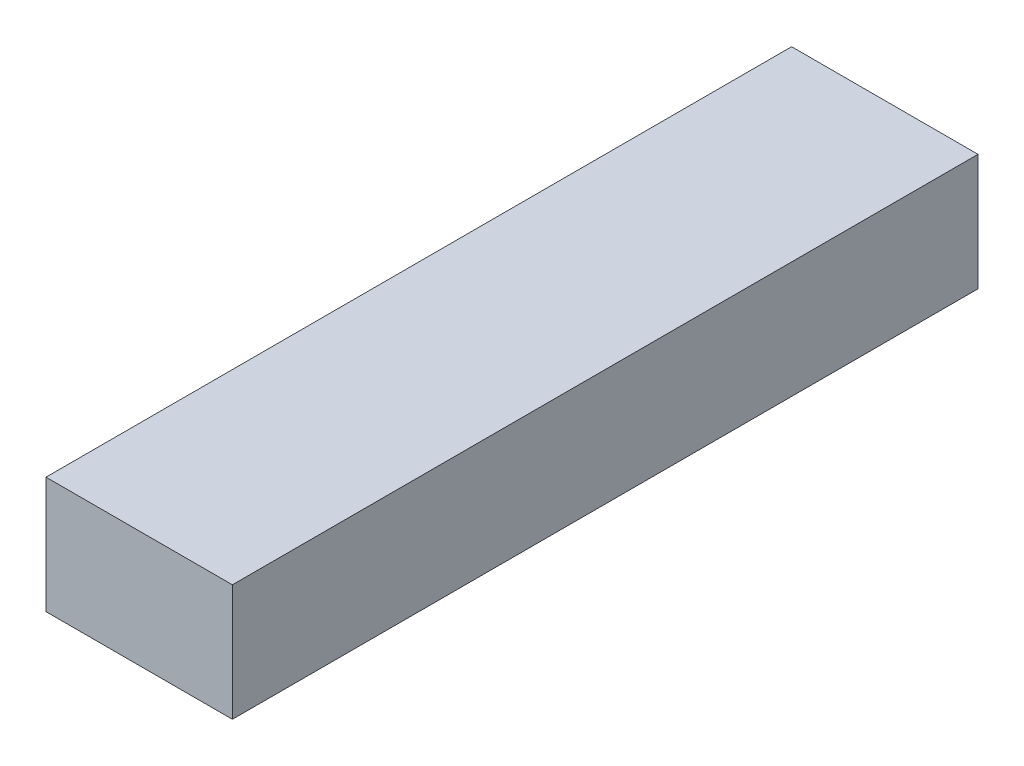
ISO-10303-21;
HEADER;
FILE_DESCRIPTION(('STEP AP214'),'2;1');
FILE_NAME('part.step','',(''),(''),'','','');
FILE_SCHEMA(('AUTOMOTIVE_DESIGN { 1 0 10303 214 1 1 1 1 }'));
ENDSEC;
DATA;
#1=APPLICATION_CONTEXT('core data for automotive mechanical design processes');
#2=APPLICATION_PROTOCOL_DEFINITION('international standard','automotive_design',2000,#1);
#3=PRODUCT_CONTEXT('',#1,'mechanical');
#4=PRODUCT('Part','Part','',(#3));
#5=PRODUCT_RELATED_PRODUCT_CATEGORY('part','',(#4));
#6=PRODUCT_DEFINITION_FORMATION('','',#4);
#7=PRODUCT_DEFINITION_CONTEXT('part definition',#1,'design');
#8=PRODUCT_DEFINITION('design','',#6,#7);
#9=PRODUCT_DEFINITION_SHAPE('','',#8);
#10=(LENGTH_UNIT() NAMED_UNIT(*) SI_UNIT(.MILLI.,.METRE.));
#11=(NAMED_UNIT(*) PLANE_ANGLE_UNIT() SI_UNIT($,.RADIAN.));
#12=(NAMED_UNIT(*) SI_UNIT($,.STERADIAN.) SOLID_ANGLE_UNIT());
#13=UNCERTAINTY_MEASURE_WITH_UNIT(LENGTH_MEASURE(1.E-05),#10,'distance_accuracy_value','');
#14=(GEOMETRIC_REPRESENTATION_CONTEXT(3) GLOBAL_UNCERTAINTY_ASSIGNED_CONTEXT((#13)) GLOBAL_UNIT_ASSIGNED_CONTEXT((#10,
#11,#12)) REPRESENTATION_CONTEXT('',''));
#15=CARTESIAN_POINT('',(0.,0.,0.));
#16=DIRECTION('',(0.,0.,1.));
#17=DIRECTION('',(1.,0.,0.));
#18=AXIS2_PLACEMENT_3D('',#15,#16,#17);
#19=CARTESIAN_POINT('',(-5.08,6.35,-20.32));
#20=DIRECTION('',(1.,0.,0.));
#21=DIRECTION('',(0.,0.,-1.));
#22=AXIS2_PLACEMENT_3D('',#19,#20,#21);
#23=PLANE('',#22);
#24=DIRECTION('',(0.,0.,1.));
#25=VECTOR('',#24,1.);
#26=CARTESIAN_POINT('',(-5.08,0.,-20.32));
#27=LINE('',#26,#25);
#28=CARTESIAN_POINT('',(-5.08,0.,-20.32));
#29=VERTEX_POINT('',#28);
#30=CARTESIAN_POINT('',(-5.08,0.,20.32));
#31=VERTEX_POINT('',#30);
#32=EDGE_CURVE('E113',#29,#31,#27,.T.);
#33=ORIENTED_EDGE('',*,*,#32,.T.);
#34=DIRECTION('',(0.,-1.,0.));
#35=VECTOR('',#34,1.);
#36=CARTESIAN_POINT('',(-5.08,6.35,20.32));
#37=LINE('',#36,#35);
#38=CARTESIAN_POINT('',(-5.08,6.35,20.32));
#39=VERTEX_POINT('',#38);
#40=EDGE_CURVE('E11',#39,#31,#37,.T.);
#41=ORIENTED_EDGE('',*,*,#40,.F.);
#42=DIRECTION('',(0.,0.,1.));
#43=VECTOR('',#42,1.);
#44=CARTESIAN_POINT('',(-5.08,6.35,-20.32));
#45=LINE('',#44,#43);
#46=CARTESIAN_POINT('',(-5.08,6.35,-20.32));
#47=VERTEX_POINT('',#46);
#48=EDGE_CURVE('E97',#47,#39,#45,.T.);
#49=ORIENTED_EDGE('',*,*,#48,.F.);
#50=DIRECTION('',(0.,-1.,0.));
#51=VECTOR('',#50,1.);
#52=CARTESIAN_POINT('',(-5.08,6.35,-20.32));
#53=LINE('',#52,#51);
#54=EDGE_CURVE('E109',#47,#29,#53,.T.);
#55=ORIENTED_EDGE('',*,*,#54,.T.);
#56=EDGE_LOOP('',(#33,#41,#49,#55));
#57=FACE_BOUND('',#56,.T.);
#58=ADVANCED_FACE('F45',(#57),#23,.F.);
#59=CARTESIAN_POINT('',(-5.08,6.35,20.32));
#60=DIRECTION('',(0.,0.,-1.));
#61=DIRECTION('',(-1.,0.,0.));
#62=AXIS2_PLACEMENT_3D('',#59,#60,#61);
#63=PLANE('',#62);
#64=DIRECTION('',(1.,0.,0.));
#65=VECTOR('',#64,1.);
#66=CARTESIAN_POINT('',(-5.08,0.,20.32));
#67=LINE('',#66,#65);
#68=CARTESIAN_POINT('',(5.08,0.,20.32));
#69=VERTEX_POINT('',#68);
#70=EDGE_CURVE('E102',#31,#69,#67,.T.);
#71=ORIENTED_EDGE('',*,*,#70,.T.);
#72=DIRECTION('',(0.,-1.,0.));
#73=VECTOR('',#72,1.);
#74=CARTESIAN_POINT('',(5.08,6.35,20.32));
#75=LINE('',#74,#73);
#76=CARTESIAN_POINT('',(5.08,6.35,20.32));
#77=VERTEX_POINT('',#76);
#78=EDGE_CURVE('E54',#77,#69,#75,.T.);
#79=ORIENTED_EDGE('',*,*,#78,.F.);
#80=DIRECTION('',(1.,0.,0.));
#81=VECTOR('',#80,1.);
#82=CARTESIAN_POINT('',(-5.08,6.35,20.32));
#83=LINE('',#82,#81);
#84=EDGE_CURVE('E92',#39,#77,#83,.T.);
#85=ORIENTED_EDGE('',*,*,#84,.F.);
#86=ORIENTED_EDGE('',*,*,#40,.T.);
#87=EDGE_LOOP('',(#71,#79,#85,#86));
#88=FACE_BOUND('',#87,.T.);
#89=ADVANCED_FACE('F101',(#88),#63,.F.);
#90=CARTESIAN_POINT('',(5.08,6.35,-20.32));
#91=DIRECTION('',(-1.,0.,0.));
#92=DIRECTION('',(0.,0.,1.));
#93=AXIS2_PLACEMENT_3D('',#90,#91,#92);
#94=PLANE('',#93);
#95=DIRECTION('',(0.,0.,-1.));
#96=VECTOR('',#95,1.);
#97=CARTESIAN_POINT('',(5.08,0.,-20.32));
#98=LINE('',#97,#96);
#99=CARTESIAN_POINT('',(5.08,0.,-20.32));
#100=VERTEX_POINT('',#99);
#101=EDGE_CURVE('E79',#69,#100,#98,.T.);
#102=ORIENTED_EDGE('',*,*,#101,.T.);
#103=DIRECTION('',(0.,-1.,0.));
#104=VECTOR('',#103,1.);
#105=CARTESIAN_POINT('',(5.08,6.35,-20.32));
#106=LINE('',#105,#104);
#107=CARTESIAN_POINT('',(5.08,6.35,-20.32));
#108=VERTEX_POINT('',#107);
#109=EDGE_CURVE('E104',#108,#100,#106,.T.);
#110=ORIENTED_EDGE('',*,*,#109,.F.);
#111=DIRECTION('',(0.,0.,-1.));
#112=VECTOR('',#111,1.);
#113=CARTESIAN_POINT('',(5.08,6.35,-20.32));
#114=LINE('',#113,#112);
#115=EDGE_CURVE('E95',#77,#108,#114,.T.);
#116=ORIENTED_EDGE('',*,*,#115,.F.);
#117=ORIENTED_EDGE('',*,*,#78,.T.);
#118=EDGE_LOOP('',(#102,#110,#116,#117));
#119=FACE_BOUND('',#118,.T.);
#120=ADVANCED_FACE('F105',(#119),#94,.F.);
#121=CARTESIAN_POINT('',(-5.08,6.35,-20.32));
#122=DIRECTION('',(0.,0.,1.));
#123=DIRECTION('',(1.,0.,0.));
#124=AXIS2_PLACEMENT_3D('',#121,#122,#123);
#125=PLANE('',#124);
#126=DIRECTION('',(-1.,0.,0.));
#127=VECTOR('',#126,1.);
#128=CARTESIAN_POINT('',(-5.08,0.,-20.32));
#129=LINE('',#128,#127);
#130=EDGE_CURVE('E85',#100,#29,#129,.T.);
#131=ORIENTED_EDGE('',*,*,#130,.T.);
#132=ORIENTED_EDGE('',*,*,#54,.F.);
#133=DIRECTION('',(-1.,0.,0.));
#134=VECTOR('',#133,1.);
#135=CARTESIAN_POINT('',(-5.08,6.35,-20.32));
#136=LINE('',#135,#134);
#137=EDGE_CURVE('E62',#108,#47,#136,.T.);
#138=ORIENTED_EDGE('',*,*,#137,.F.);
#139=ORIENTED_EDGE('',*,*,#109,.T.);
#140=EDGE_LOOP('',(#131,#132,#138,#139));
#141=FACE_BOUND('',#140,.T.);
#142=ADVANCED_FACE('F126',(#141),#125,.F.);
#143=CARTESIAN_POINT('',(0.,6.35,0.));
#144=DIRECTION('',(0.,1.,0.));
#145=DIRECTION('',(0.,0.,1.));
#146=AXIS2_PLACEMENT_3D('',#143,#144,#145);
#147=PLANE('',#146);
#148=ORIENTED_EDGE('',*,*,#48,.T.);
#149=ORIENTED_EDGE('',*,*,#84,.T.);
#150=ORIENTED_EDGE('',*,*,#115,.T.);
#151=ORIENTED_EDGE('',*,*,#137,.T.);
#152=EDGE_LOOP('',(#148,#149,#150,#151));
#153=FACE_BOUND('',#152,.T.);
#154=ADVANCED_FACE('F93',(#153),#147,.T.);
#155=CARTESIAN_POINT('',(0.,0.,0.));
#156=DIRECTION('',(0.,1.,0.));
#157=DIRECTION('',(0.,0.,1.));
#158=AXIS2_PLACEMENT_3D('',#155,#156,#157);
#159=PLANE('',#158);
#160=ORIENTED_EDGE('',*,*,#32,.F.);
#161=ORIENTED_EDGE('',*,*,#130,.F.);
#162=ORIENTED_EDGE('',*,*,#101,.F.);
#163=ORIENTED_EDGE('',*,*,#70,.F.);
#164=EDGE_LOOP('',(#160,#161,#162,#163));
#165=FACE_BOUND('',#164,.T.);
#166=ADVANCED_FACE('F129',(#165),#159,.F.);
#167=CLOSED_SHELL('',(#58,#89,#120,#142,#154,#166));
#168=MANIFOLD_SOLID_BREP('B2',#167);
#169=ADVANCED_BREP_SHAPE_REPRESENTATION('',(#18,#168),#14);
#170=SHAPE_DEFINITION_REPRESENTATION(#9,#169);
ENDSEC;
END-ISO-10303-21;
